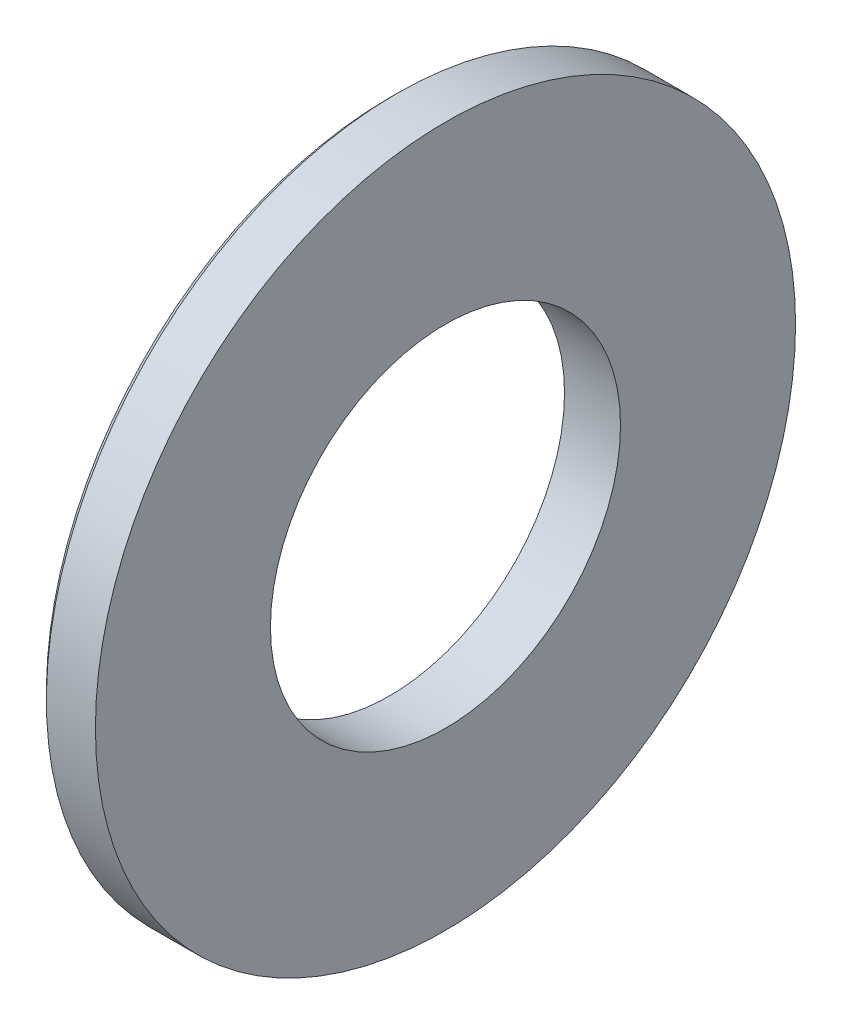
ISO-10303-21;
HEADER;
FILE_DESCRIPTION(('STEP AP214'),'2;1');
FILE_NAME('part.step','',(''),(''),'','','');
FILE_SCHEMA(('AUTOMOTIVE_DESIGN { 1 0 10303 214 1 1 1 1 }'));
ENDSEC;
DATA;
#1=APPLICATION_CONTEXT('core data for automotive mechanical design processes');
#2=APPLICATION_PROTOCOL_DEFINITION('international standard','automotive_design',2000,#1);
#3=PRODUCT_CONTEXT('',#1,'mechanical');
#4=PRODUCT('Part','Part','',(#3));
#5=PRODUCT_RELATED_PRODUCT_CATEGORY('part','',(#4));
#6=PRODUCT_DEFINITION_FORMATION('','',#4);
#7=PRODUCT_DEFINITION_CONTEXT('part definition',#1,'design');
#8=PRODUCT_DEFINITION('design','',#6,#7);
#9=PRODUCT_DEFINITION_SHAPE('','',#8);
#10=(LENGTH_UNIT() NAMED_UNIT(*) SI_UNIT(.MILLI.,.METRE.));
#11=(NAMED_UNIT(*) PLANE_ANGLE_UNIT() SI_UNIT($,.RADIAN.));
#12=(NAMED_UNIT(*) SI_UNIT($,.STERADIAN.) SOLID_ANGLE_UNIT());
#13=UNCERTAINTY_MEASURE_WITH_UNIT(LENGTH_MEASURE(1.E-05),#10,'distance_accuracy_value','');
#14=(GEOMETRIC_REPRESENTATION_CONTEXT(3) GLOBAL_UNCERTAINTY_ASSIGNED_CONTEXT((#13)) GLOBAL_UNIT_ASSIGNED_CONTEXT((#10,
#11,#12)) REPRESENTATION_CONTEXT('',''));
#15=CARTESIAN_POINT('',(0.,0.,0.));
#16=DIRECTION('',(0.,0.,1.));
#17=DIRECTION('',(1.,0.,0.));
#18=AXIS2_PLACEMENT_3D('',#15,#16,#17);
#19=CARTESIAN_POINT('',(0.,0.,3.75));
#20=DIRECTION('',(-1.,0.,0.));
#21=DIRECTION('',(0.,0.,1.));
#22=AXIS2_PLACEMENT_3D('',#19,#20,#21);
#23=PLANE('',#22);
#24=CARTESIAN_POINT('',(0.,0.,0.));
#25=DIRECTION('',(1.,0.,0.));
#26=DIRECTION('',(0.,0.,-1.));
#27=AXIS2_PLACEMENT_3D('',#24,#25,#26);
#28=CIRCLE('',#27,2.5);
#29=CARTESIAN_POINT('',(0.,0.,-2.5));
#30=VERTEX_POINT('',#29);
#31=EDGE_CURVE('E30',#30,#30,#28,.T.);
#32=ORIENTED_EDGE('',*,*,#31,.T.);
#33=EDGE_LOOP('',(#32));
#34=FACE_BOUND('',#33,.T.);
#35=CARTESIAN_POINT('',(0.,0.,0.));
#36=DIRECTION('',(1.,0.,0.));
#37=DIRECTION('',(0.,1.,0.));
#38=AXIS2_PLACEMENT_3D('',#35,#36,#37);
#39=CIRCLE('',#38,4.9000000000774);
#40=CARTESIAN_POINT('',(0.,4.9000000000774,0.));
#41=VERTEX_POINT('',#40);
#42=EDGE_CURVE('E18',#41,#41,#39,.T.);
#43=ORIENTED_EDGE('',*,*,#42,.F.);
#44=EDGE_LOOP('',(#43));
#45=FACE_BOUND('',#44,.T.);
#46=ADVANCED_FACE('F15',(#34,#45),#23,.T.);
#47=CARTESIAN_POINT('',(0.0999999999748979,0.,0.));
#48=DIRECTION('',(1.,0.,0.));
#49=DIRECTION('',(0.,1.,0.));
#50=AXIS2_PLACEMENT_3D('',#47,#48,#49);
#51=CONICAL_SURFACE('',#50,4.99999999999545,0.785398163113231);
#52=CARTESIAN_POINT('',(0.1,0.,0.));
#53=DIRECTION('',(1.,0.,0.));
#54=DIRECTION('',(0.,0.,-1.));
#55=AXIS2_PLACEMENT_3D('',#52,#53,#54);
#56=CIRCLE('',#55,5.);
#57=CARTESIAN_POINT('',(0.1,0.,-5.));
#58=VERTEX_POINT('',#57);
#59=EDGE_CURVE('E27',#58,#58,#56,.T.);
#60=ORIENTED_EDGE('',*,*,#59,.F.);
#61=EDGE_LOOP('',(#60));
#62=FACE_BOUND('',#61,.T.);
#63=ORIENTED_EDGE('',*,*,#42,.T.);
#64=EDGE_LOOP('',(#63));
#65=FACE_BOUND('',#64,.T.);
#66=ADVANCED_FACE('F38',(#62,#65),#51,.T.);
#67=CARTESIAN_POINT('',(0.4,0.,0.));
#68=DIRECTION('',(1.,0.,0.));
#69=DIRECTION('',(0.,0.,-1.));
#70=AXIS2_PLACEMENT_3D('',#67,#68,#69);
#71=CYLINDRICAL_SURFACE('',#70,2.5);
#72=ORIENTED_EDGE('',*,*,#31,.F.);
#73=EDGE_LOOP('',(#72));
#74=FACE_BOUND('',#73,.T.);
#75=CARTESIAN_POINT('',(0.8,0.,0.));
#76=DIRECTION('',(1.,0.,0.));
#77=DIRECTION('',(0.,0.,-1.));
#78=AXIS2_PLACEMENT_3D('',#75,#76,#77);
#79=CIRCLE('',#78,2.5);
#80=CARTESIAN_POINT('',(0.8,0.,-2.5));
#81=VERTEX_POINT('',#80);
#82=EDGE_CURVE('E22',#81,#81,#79,.F.);
#83=ORIENTED_EDGE('',*,*,#82,.F.);
#84=EDGE_LOOP('',(#83));
#85=FACE_BOUND('',#84,.T.);
#86=ADVANCED_FACE('F45',(#74,#85),#71,.F.);
#87=CARTESIAN_POINT('',(0.4,0.,0.));
#88=DIRECTION('',(1.,0.,0.));
#89=DIRECTION('',(0.,0.,-1.));
#90=AXIS2_PLACEMENT_3D('',#87,#88,#89);
#91=CYLINDRICAL_SURFACE('',#90,5.);
#92=CARTESIAN_POINT('',(0.8,0.,0.));
#93=DIRECTION('',(1.,0.,0.));
#94=DIRECTION('',(0.,0.,-1.));
#95=AXIS2_PLACEMENT_3D('',#92,#93,#94);
#96=CIRCLE('',#95,5.);
#97=CARTESIAN_POINT('',(0.8,0.,-5.));
#98=VERTEX_POINT('',#97);
#99=EDGE_CURVE('E10',#98,#98,#96,.T.);
#100=ORIENTED_EDGE('',*,*,#99,.F.);
#101=EDGE_LOOP('',(#100));
#102=FACE_BOUND('',#101,.T.);
#103=ORIENTED_EDGE('',*,*,#59,.T.);
#104=EDGE_LOOP('',(#103));
#105=FACE_BOUND('',#104,.T.);
#106=ADVANCED_FACE('F49',(#102,#105),#91,.T.);
#107=CARTESIAN_POINT('',(0.8,0.,3.75));
#108=DIRECTION('',(1.,0.,0.));
#109=DIRECTION('',(0.,0.,-1.));
#110=AXIS2_PLACEMENT_3D('',#107,#108,#109);
#111=PLANE('',#110);
#112=ORIENTED_EDGE('',*,*,#99,.T.);
#113=EDGE_LOOP('',(#112));
#114=FACE_BOUND('',#113,.T.);
#115=ORIENTED_EDGE('',*,*,#82,.T.);
#116=EDGE_LOOP('',(#115));
#117=FACE_BOUND('',#116,.T.);
#118=ADVANCED_FACE('F47',(#114,#117),#111,.T.);
#119=CLOSED_SHELL('',(#46,#66,#86,#106,#118));
#120=MANIFOLD_SOLID_BREP('B1',#119);
#121=ADVANCED_BREP_SHAPE_REPRESENTATION('',(#18,#120),#14);
#122=SHAPE_DEFINITION_REPRESENTATION(#9,#121);
ENDSEC;
END-ISO-10303-21;
